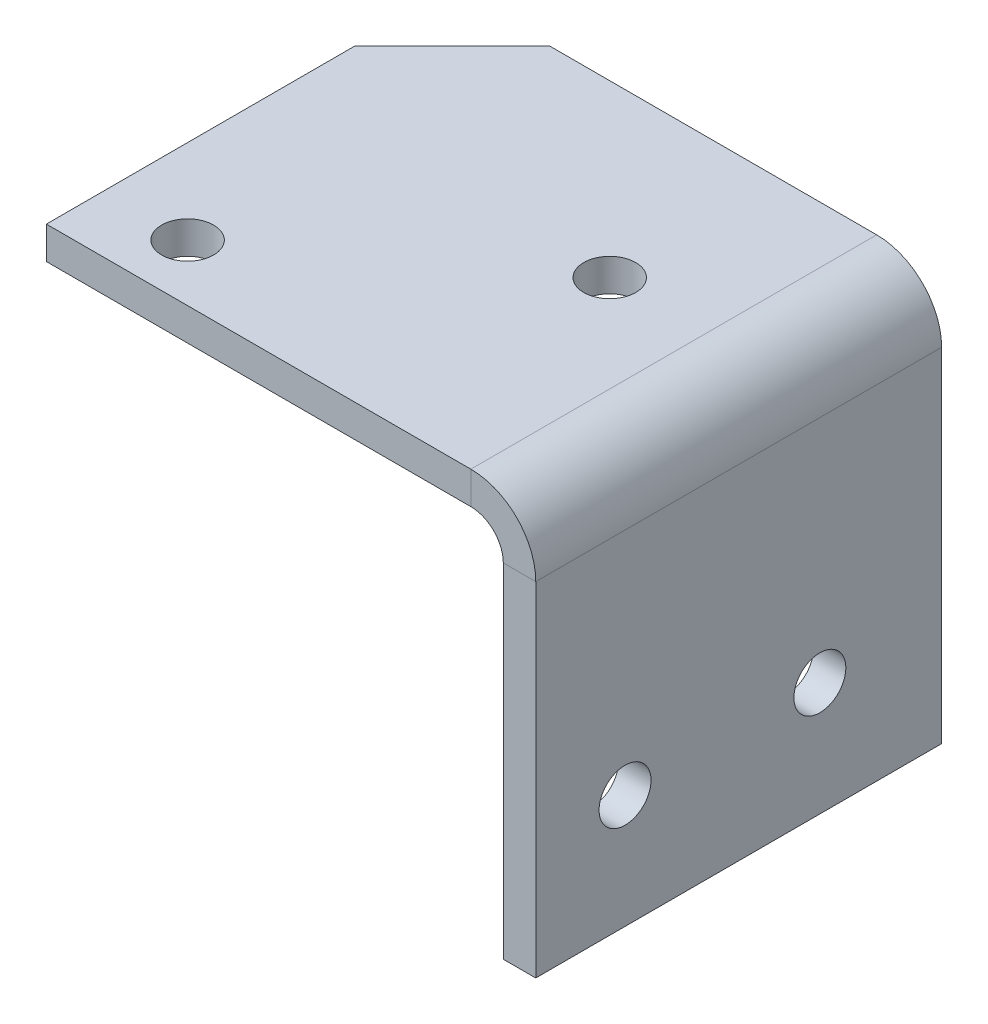
ISO-10303-21;
HEADER;
FILE_DESCRIPTION(('STEP AP214'),'2;1');
FILE_NAME('part.step','',(''),(''),'','','');
FILE_SCHEMA(('AUTOMOTIVE_DESIGN { 1 0 10303 214 1 1 1 1 }'));
ENDSEC;
DATA;
#1=APPLICATION_CONTEXT('core data for automotive mechanical design processes');
#2=APPLICATION_PROTOCOL_DEFINITION('international standard','automotive_design',2000,#1);
#3=PRODUCT_CONTEXT('',#1,'mechanical');
#4=PRODUCT('Part','Part','',(#3));
#5=PRODUCT_RELATED_PRODUCT_CATEGORY('part','',(#4));
#6=PRODUCT_DEFINITION_FORMATION('','',#4);
#7=PRODUCT_DEFINITION_CONTEXT('part definition',#1,'design');
#8=PRODUCT_DEFINITION('design','',#6,#7);
#9=PRODUCT_DEFINITION_SHAPE('','',#8);
#10=(LENGTH_UNIT() NAMED_UNIT(*) SI_UNIT(.MILLI.,.METRE.));
#11=(NAMED_UNIT(*) PLANE_ANGLE_UNIT() SI_UNIT($,.RADIAN.));
#12=(NAMED_UNIT(*) SI_UNIT($,.STERADIAN.) SOLID_ANGLE_UNIT());
#13=UNCERTAINTY_MEASURE_WITH_UNIT(LENGTH_MEASURE(1.E-05),#10,'distance_accuracy_value','');
#14=(GEOMETRIC_REPRESENTATION_CONTEXT(3) GLOBAL_UNCERTAINTY_ASSIGNED_CONTEXT((#13)) GLOBAL_UNIT_ASSIGNED_CONTEXT((#10,
#11,#12)) REPRESENTATION_CONTEXT('',''));
#15=CARTESIAN_POINT('',(0.,0.,0.));
#16=DIRECTION('',(0.,0.,1.));
#17=DIRECTION('',(1.,0.,0.));
#18=AXIS2_PLACEMENT_3D('',#15,#16,#17);
#19=CARTESIAN_POINT('',(23.8561944901924,23.1438055098077,0.));
#20=DIRECTION('',(0.,1.,0.));
#21=DIRECTION('',(0.,0.,-1.));
#22=AXIS2_PLACEMENT_3D('',#19,#20,#21);
#23=PLANE('',#22);
#24=CARTESIAN_POINT('',(-7.94380550980765,23.1438055098076,-14.5));
#25=DIRECTION('',(0.,1.,0.));
#26=DIRECTION('',(0.,0.,-1.));
#27=AXIS2_PLACEMENT_3D('',#24,#25,#26);
#28=CIRCLE('',#27,1.6);
#29=CARTESIAN_POINT('',(-7.94380550980765,23.1438055098076,-16.1));
#30=VERTEX_POINT('',#29);
#31=EDGE_CURVE('E196',#30,#30,#28,.T.);
#32=ORIENTED_EDGE('',*,*,#31,.T.);
#33=EDGE_LOOP('',(#32));
#34=FACE_BOUND('',#33,.T.);
#35=CARTESIAN_POINT('',(-22.9438055098076,23.1438055098076,-3.49999999999999));
#36=DIRECTION('',(0.,1.,0.));
#37=DIRECTION('',(0.,0.,-1.));
#38=AXIS2_PLACEMENT_3D('',#35,#36,#37);
#39=CIRCLE('',#38,1.6);
#40=CARTESIAN_POINT('',(-22.9438055098076,23.1438055098076,-5.09999999999999));
#41=VERTEX_POINT('',#40);
#42=EDGE_CURVE('E190',#41,#41,#39,.T.);
#43=ORIENTED_EDGE('',*,*,#42,.T.);
#44=EDGE_LOOP('',(#43));
#45=FACE_BOUND('',#44,.T.);
#46=DIRECTION('',(0.,0.,1.));
#47=VECTOR('',#46,1.);
#48=CARTESIAN_POINT('',(-28.1438055098076,23.1438055098076,0.));
#49=LINE('',#48,#47);
#50=CARTESIAN_POINT('',(-28.1438055098076,23.1438055098076,-18.9999999999999));
#51=VERTEX_POINT('',#50);
#52=CARTESIAN_POINT('',(-28.1438055098076,23.1438055098076,0.));
#53=VERTEX_POINT('',#52);
#54=EDGE_CURVE('E204',#51,#53,#49,.T.);
#55=ORIENTED_EDGE('',*,*,#54,.F.);
#56=DIRECTION('',(-0.707106781186548,0.,0.707106781186548));
#57=VECTOR('',#56,1.);
#58=CARTESIAN_POINT('',(-28.1438055098076,23.1438055098076,-18.9999999999999));
#59=LINE('',#58,#57);
#60=CARTESIAN_POINT('',(-22.1438055098076,23.1438055098076,-25.));
#61=VERTEX_POINT('',#60);
#62=EDGE_CURVE('E67',#51,#61,#59,.F.);
#63=ORIENTED_EDGE('',*,*,#62,.T.);
#64=DIRECTION('',(-1.,0.,0.));
#65=VECTOR('',#64,1.);
#66=CARTESIAN_POINT('',(-28.1438055098076,23.1438055098076,-25.));
#67=LINE('',#66,#65);
#68=CARTESIAN_POINT('',(-2.00000000000001,23.1438055098077,-25.));
#69=VERTEX_POINT('',#68);
#70=EDGE_CURVE('E207',#69,#61,#67,.T.);
#71=ORIENTED_EDGE('',*,*,#70,.F.);
#72=DIRECTION('',(0.,0.,1.));
#73=VECTOR('',#72,1.);
#74=CARTESIAN_POINT('',(-2.,23.1438055098077,0.));
#75=LINE('',#74,#73);
#76=CARTESIAN_POINT('',(-2.00000000000001,23.1438055098077,0.));
#77=VERTEX_POINT('',#76);
#78=EDGE_CURVE('E213',#69,#77,#75,.T.);
#79=ORIENTED_EDGE('',*,*,#78,.T.);
#80=DIRECTION('',(1.,0.,0.));
#81=VECTOR('',#80,1.);
#82=CARTESIAN_POINT('',(-28.1438055098076,23.1438055098076,0.));
#83=LINE('',#82,#81);
#84=EDGE_CURVE('E199',#53,#77,#83,.T.);
#85=ORIENTED_EDGE('',*,*,#84,.F.);
#86=EDGE_LOOP('',(#55,#63,#71,#79,#85));
#87=FACE_BOUND('',#86,.T.);
#88=ADVANCED_FACE('F44',(#34,#45,#87),#23,.F.);
#89=CARTESIAN_POINT('',(-28.1438055098077,25.1438055098076,-25.));
#90=DIRECTION('',(0.,0.,1.));
#91=DIRECTION('',(1.,0.,0.));
#92=AXIS2_PLACEMENT_3D('',#89,#90,#91);
#93=PLANE('',#92);
#94=ORIENTED_EDGE('',*,*,#70,.T.);
#95=DIRECTION('',(0.,1.,0.));
#96=VECTOR('',#95,1.);
#97=CARTESIAN_POINT('',(-22.1438055098076,25.1438055098076,-25.));
#98=LINE('',#97,#96);
#99=CARTESIAN_POINT('',(-22.1438055098076,25.1438055098076,-25.));
#100=VERTEX_POINT('',#99);
#101=EDGE_CURVE('E53',#61,#100,#98,.T.);
#102=ORIENTED_EDGE('',*,*,#101,.T.);
#103=DIRECTION('',(-1.,0.,0.));
#104=VECTOR('',#103,1.);
#105=CARTESIAN_POINT('',(-28.1438055098077,25.1438055098076,-25.));
#106=LINE('',#105,#104);
#107=CARTESIAN_POINT('',(-2.00000000000001,25.1438055098077,-25.));
#108=VERTEX_POINT('',#107);
#109=EDGE_CURVE('E203',#108,#100,#106,.T.);
#110=ORIENTED_EDGE('',*,*,#109,.F.);
#111=DIRECTION('',(0.,-1.,0.));
#112=VECTOR('',#111,1.);
#113=CARTESIAN_POINT('',(-2.00000000000001,25.1438055098077,-25.));
#114=LINE('',#113,#112);
#115=EDGE_CURVE('E216',#108,#69,#114,.T.);
#116=ORIENTED_EDGE('',*,*,#115,.T.);
#117=EDGE_LOOP('',(#94,#102,#110,#116));
#118=FACE_BOUND('',#117,.T.);
#119=ADVANCED_FACE('F250',(#118),#93,.F.);
#120=CARTESIAN_POINT('',(-28.1438055098077,25.1438055098076,0.));
#121=DIRECTION('',(0.,0.,-1.));
#122=DIRECTION('',(-1.,0.,0.));
#123=AXIS2_PLACEMENT_3D('',#120,#121,#122);
#124=PLANE('',#123);
#125=ORIENTED_EDGE('',*,*,#84,.T.);
#126=DIRECTION('',(0.,1.,0.));
#127=VECTOR('',#126,1.);
#128=CARTESIAN_POINT('',(-2.00000000000001,25.1438055098077,0.));
#129=LINE('',#128,#127);
#130=CARTESIAN_POINT('',(-2.00000000000002,25.1438055098076,0.));
#131=VERTEX_POINT('',#130);
#132=EDGE_CURVE('E211',#77,#131,#129,.T.);
#133=ORIENTED_EDGE('',*,*,#132,.T.);
#134=DIRECTION('',(1.,0.,0.));
#135=VECTOR('',#134,1.);
#136=CARTESIAN_POINT('',(-28.1438055098077,25.1438055098076,0.));
#137=LINE('',#136,#135);
#138=CARTESIAN_POINT('',(-28.1438055098077,25.1438055098076,0.));
#139=VERTEX_POINT('',#138);
#140=EDGE_CURVE('E206',#139,#131,#137,.T.);
#141=ORIENTED_EDGE('',*,*,#140,.F.);
#142=DIRECTION('',(0.,-1.,0.));
#143=VECTOR('',#142,1.);
#144=CARTESIAN_POINT('',(-28.1438055098077,25.1438055098076,0.));
#145=LINE('',#144,#143);
#146=EDGE_CURVE('E202',#139,#53,#145,.T.);
#147=ORIENTED_EDGE('',*,*,#146,.T.);
#148=EDGE_LOOP('',(#125,#133,#141,#147));
#149=FACE_BOUND('',#148,.T.);
#150=ADVANCED_FACE('F237',(#149),#124,.F.);
#151=CARTESIAN_POINT('',(-28.1438055098077,25.1438055098076,0.));
#152=DIRECTION('',(1.,0.,0.));
#153=DIRECTION('',(0.,0.,-1.));
#154=AXIS2_PLACEMENT_3D('',#151,#152,#153);
#155=PLANE('',#154);
#156=DIRECTION('',(0.,0.,1.));
#157=VECTOR('',#156,1.);
#158=CARTESIAN_POINT('',(-28.1438055098077,25.1438055098076,0.));
#159=LINE('',#158,#157);
#160=CARTESIAN_POINT('',(-28.1438055098077,25.1438055098076,-18.9999999999999));
#161=VERTEX_POINT('',#160);
#162=EDGE_CURVE('E200',#161,#139,#159,.T.);
#163=ORIENTED_EDGE('',*,*,#162,.F.);
#164=DIRECTION('',(0.,-1.,0.));
#165=VECTOR('',#164,1.);
#166=CARTESIAN_POINT('',(-28.1438055098077,25.1438055098076,-18.9999999999999));
#167=LINE('',#166,#165);
#168=EDGE_CURVE('E219',#161,#51,#167,.T.);
#169=ORIENTED_EDGE('',*,*,#168,.T.);
#170=ORIENTED_EDGE('',*,*,#54,.T.);
#171=ORIENTED_EDGE('',*,*,#146,.F.);
#172=EDGE_LOOP('',(#163,#169,#170,#171));
#173=FACE_BOUND('',#172,.T.);
#174=ADVANCED_FACE('F230',(#173),#155,.F.);
#175=CARTESIAN_POINT('',(23.8561944901923,25.1438055098077,0.));
#176=DIRECTION('',(0.,1.,0.));
#177=DIRECTION('',(0.,0.,-1.));
#178=AXIS2_PLACEMENT_3D('',#175,#176,#177);
#179=PLANE('',#178);
#180=ORIENTED_EDGE('',*,*,#109,.T.);
#181=DIRECTION('',(0.707106781186548,0.,-0.707106781186548));
#182=VECTOR('',#181,1.);
#183=CARTESIAN_POINT('',(-11.6438055098076,25.1438055098076,-35.5));
#184=LINE('',#183,#182);
#185=EDGE_CURVE('E12',#100,#161,#184,.F.);
#186=ORIENTED_EDGE('',*,*,#185,.T.);
#187=ORIENTED_EDGE('',*,*,#162,.T.);
#188=ORIENTED_EDGE('',*,*,#140,.T.);
#189=DIRECTION('',(0.,0.,1.));
#190=VECTOR('',#189,1.);
#191=CARTESIAN_POINT('',(-2.00000000000001,25.1438055098077,0.));
#192=LINE('',#191,#190);
#193=EDGE_CURVE('E151',#108,#131,#192,.T.);
#194=ORIENTED_EDGE('',*,*,#193,.F.);
#195=EDGE_LOOP('',(#180,#186,#187,#188,#194));
#196=FACE_BOUND('',#195,.T.);
#197=CARTESIAN_POINT('',(-22.9438055098077,25.1438055098076,-3.49999999999999));
#198=DIRECTION('',(0.,1.,0.));
#199=DIRECTION('',(0.,0.,-1.));
#200=AXIS2_PLACEMENT_3D('',#197,#198,#199);
#201=CIRCLE('',#200,1.6);
#202=CARTESIAN_POINT('',(-22.9438055098077,25.1438055098076,-5.09999999999999));
#203=VERTEX_POINT('',#202);
#204=EDGE_CURVE('E165',#203,#203,#201,.T.);
#205=ORIENTED_EDGE('',*,*,#204,.F.);
#206=EDGE_LOOP('',(#205));
#207=FACE_BOUND('',#206,.T.);
#208=CARTESIAN_POINT('',(-7.94380550980766,25.1438055098076,-14.5));
#209=DIRECTION('',(0.,1.,0.));
#210=DIRECTION('',(0.,0.,-1.));
#211=AXIS2_PLACEMENT_3D('',#208,#209,#210);
#212=CIRCLE('',#211,1.6);
#213=CARTESIAN_POINT('',(-7.94380550980766,25.1438055098076,-16.1));
#214=VERTEX_POINT('',#213);
#215=EDGE_CURVE('E193',#214,#214,#212,.T.);
#216=ORIENTED_EDGE('',*,*,#215,.F.);
#217=EDGE_LOOP('',(#216));
#218=FACE_BOUND('',#217,.T.);
#219=ADVANCED_FACE('F240',(#196,#207,#218),#179,.T.);
#220=CARTESIAN_POINT('',(-7.94380550980766,25.1438055098076,-14.5));
#221=DIRECTION('',(0.,1.,0.));
#222=DIRECTION('',(0.,0.,-1.));
#223=AXIS2_PLACEMENT_3D('',#220,#221,#222);
#224=CYLINDRICAL_SURFACE('',#223,1.6);
#225=ORIENTED_EDGE('',*,*,#31,.F.);
#226=EDGE_LOOP('',(#225));
#227=FACE_BOUND('',#226,.T.);
#228=ORIENTED_EDGE('',*,*,#215,.T.);
#229=EDGE_LOOP('',(#228));
#230=FACE_BOUND('',#229,.T.);
#231=ADVANCED_FACE('F262',(#227,#230),#224,.F.);
#232=CARTESIAN_POINT('',(-22.9438055098077,25.1438055098076,-3.49999999999999));
#233=DIRECTION('',(0.,1.,0.));
#234=DIRECTION('',(0.,0.,-1.));
#235=AXIS2_PLACEMENT_3D('',#232,#233,#234);
#236=CYLINDRICAL_SURFACE('',#235,1.6);
#237=ORIENTED_EDGE('',*,*,#42,.F.);
#238=EDGE_LOOP('',(#237));
#239=FACE_BOUND('',#238,.T.);
#240=ORIENTED_EDGE('',*,*,#204,.T.);
#241=EDGE_LOOP('',(#240));
#242=FACE_BOUND('',#241,.T.);
#243=ADVANCED_FACE('F267',(#239,#242),#236,.F.);
#244=CARTESIAN_POINT('',(2.,0.,0.));
#245=DIRECTION('',(0.,1.,0.));
#246=DIRECTION('',(0.,0.,1.));
#247=AXIS2_PLACEMENT_3D('',#244,#245,#246);
#248=PLANE('',#247);
#249=DIRECTION('',(0.,0.,-1.));
#250=VECTOR('',#249,1.);
#251=CARTESIAN_POINT('',(0.,0.,0.));
#252=LINE('',#251,#250);
#253=CARTESIAN_POINT('',(0.,0.,0.));
#254=VERTEX_POINT('',#253);
#255=CARTESIAN_POINT('',(0.,0.,-25.));
#256=VERTEX_POINT('',#255);
#257=EDGE_CURVE('E146',#254,#256,#252,.T.);
#258=ORIENTED_EDGE('',*,*,#257,.T.);
#259=DIRECTION('',(-1.,0.,0.));
#260=VECTOR('',#259,1.);
#261=CARTESIAN_POINT('',(2.,0.,-25.));
#262=LINE('',#261,#260);
#263=CARTESIAN_POINT('',(2.,0.,-25.));
#264=VERTEX_POINT('',#263);
#265=EDGE_CURVE('E166',#264,#256,#262,.T.);
#266=ORIENTED_EDGE('',*,*,#265,.F.);
#267=DIRECTION('',(0.,0.,-1.));
#268=VECTOR('',#267,1.);
#269=CARTESIAN_POINT('',(2.,0.,0.));
#270=LINE('',#269,#268);
#271=CARTESIAN_POINT('',(2.,0.,0.));
#272=VERTEX_POINT('',#271);
#273=EDGE_CURVE('E125',#272,#264,#270,.T.);
#274=ORIENTED_EDGE('',*,*,#273,.F.);
#275=DIRECTION('',(-1.,0.,0.));
#276=VECTOR('',#275,1.);
#277=CARTESIAN_POINT('',(2.,0.,0.));
#278=LINE('',#277,#276);
#279=EDGE_CURVE('E122',#272,#254,#278,.T.);
#280=ORIENTED_EDGE('',*,*,#279,.T.);
#281=EDGE_LOOP('',(#258,#266,#274,#280));
#282=FACE_BOUND('',#281,.T.);
#283=ADVANCED_FACE('F271',(#282),#248,.F.);
#284=CARTESIAN_POINT('',(2.,7.,-5.49999999999999));
#285=DIRECTION('',(1.,0.,0.));
#286=DIRECTION('',(0.,0.,-1.));
#287=AXIS2_PLACEMENT_3D('',#284,#285,#286);
#288=CYLINDRICAL_SURFACE('',#287,1.6);
#289=CARTESIAN_POINT('',(0.,7.,-5.49999999999999));
#290=DIRECTION('',(1.,0.,0.));
#291=DIRECTION('',(0.,0.,-1.));
#292=AXIS2_PLACEMENT_3D('',#289,#290,#291);
#293=CIRCLE('',#292,1.6);
#294=CARTESIAN_POINT('',(0.,7.,-7.09999999999999));
#295=VERTEX_POINT('',#294);
#296=EDGE_CURVE('E172',#295,#295,#293,.T.);
#297=ORIENTED_EDGE('',*,*,#296,.F.);
#298=EDGE_LOOP('',(#297));
#299=FACE_BOUND('',#298,.T.);
#300=CARTESIAN_POINT('',(2.,7.,-5.49999999999999));
#301=DIRECTION('',(1.,0.,0.));
#302=DIRECTION('',(0.,0.,-1.));
#303=AXIS2_PLACEMENT_3D('',#300,#301,#302);
#304=CIRCLE('',#303,1.6);
#305=CARTESIAN_POINT('',(2.,7.,-7.09999999999999));
#306=VERTEX_POINT('',#305);
#307=EDGE_CURVE('E182',#306,#306,#304,.T.);
#308=ORIENTED_EDGE('',*,*,#307,.T.);
#309=EDGE_LOOP('',(#308));
#310=FACE_BOUND('',#309,.T.);
#311=ADVANCED_FACE('F290',(#299,#310),#288,.F.);
#312=CARTESIAN_POINT('',(2.,7.,-17.5));
#313=DIRECTION('',(1.,0.,0.));
#314=DIRECTION('',(0.,0.,-1.));
#315=AXIS2_PLACEMENT_3D('',#312,#313,#314);
#316=CYLINDRICAL_SURFACE('',#315,1.6);
#317=CARTESIAN_POINT('',(0.,7.,-17.5));
#318=DIRECTION('',(1.,0.,0.));
#319=DIRECTION('',(0.,0.,-1.));
#320=AXIS2_PLACEMENT_3D('',#317,#318,#319);
#321=CIRCLE('',#320,1.6);
#322=CARTESIAN_POINT('',(0.,7.,-19.1));
#323=VERTEX_POINT('',#322);
#324=EDGE_CURVE('E169',#323,#323,#321,.T.);
#325=ORIENTED_EDGE('',*,*,#324,.F.);
#326=EDGE_LOOP('',(#325));
#327=FACE_BOUND('',#326,.T.);
#328=CARTESIAN_POINT('',(2.,7.,-17.5));
#329=DIRECTION('',(1.,0.,0.));
#330=DIRECTION('',(0.,0.,-1.));
#331=AXIS2_PLACEMENT_3D('',#328,#329,#330);
#332=CIRCLE('',#331,1.6);
#333=CARTESIAN_POINT('',(2.,7.,-19.1));
#334=VERTEX_POINT('',#333);
#335=EDGE_CURVE('E179',#334,#334,#332,.T.);
#336=ORIENTED_EDGE('',*,*,#335,.T.);
#337=EDGE_LOOP('',(#336));
#338=FACE_BOUND('',#337,.T.);
#339=ADVANCED_FACE('F286',(#327,#338),#316,.F.);
#340=CARTESIAN_POINT('',(2.,0.,0.));
#341=DIRECTION('',(1.,0.,0.));
#342=DIRECTION('',(0.,0.,-1.));
#343=AXIS2_PLACEMENT_3D('',#340,#341,#342);
#344=PLANE('',#343);
#345=ORIENTED_EDGE('',*,*,#335,.F.);
#346=EDGE_LOOP('',(#345));
#347=FACE_BOUND('',#346,.T.);
#348=ORIENTED_EDGE('',*,*,#307,.F.);
#349=EDGE_LOOP('',(#348));
#350=FACE_BOUND('',#349,.T.);
#351=DIRECTION('',(0.,1.,0.));
#352=VECTOR('',#351,1.);
#353=CARTESIAN_POINT('',(2.,52.,-25.));
#354=LINE('',#353,#352);
#355=CARTESIAN_POINT('',(2.,21.1438055098077,-25.));
#356=VERTEX_POINT('',#355);
#357=EDGE_CURVE('E131',#264,#356,#354,.T.);
#358=ORIENTED_EDGE('',*,*,#357,.T.);
#359=DIRECTION('',(0.,0.,1.));
#360=VECTOR('',#359,1.);
#361=CARTESIAN_POINT('',(2.,21.1438055098076,0.));
#362=LINE('',#361,#360);
#363=CARTESIAN_POINT('',(2.,21.1438055098077,0.));
#364=VERTEX_POINT('',#363);
#365=EDGE_CURVE('E126',#356,#364,#362,.T.);
#366=ORIENTED_EDGE('',*,*,#365,.T.);
#367=DIRECTION('',(0.,-1.,0.));
#368=VECTOR('',#367,1.);
#369=CARTESIAN_POINT('',(2.,52.,0.));
#370=LINE('',#369,#368);
#371=EDGE_CURVE('E115',#364,#272,#370,.T.);
#372=ORIENTED_EDGE('',*,*,#371,.T.);
#373=ORIENTED_EDGE('',*,*,#273,.T.);
#374=EDGE_LOOP('',(#358,#366,#372,#373));
#375=FACE_BOUND('',#374,.T.);
#376=ADVANCED_FACE('F129',(#347,#350,#375),#344,.T.);
#377=CARTESIAN_POINT('',(2.,52.,0.));
#378=DIRECTION('',(0.,0.,-1.));
#379=DIRECTION('',(0.,1.,0.));
#380=AXIS2_PLACEMENT_3D('',#377,#378,#379);
#381=PLANE('',#380);
#382=DIRECTION('',(1.,0.,0.));
#383=VECTOR('',#382,1.);
#384=CARTESIAN_POINT('',(2.,21.1438055098076,0.));
#385=LINE('',#384,#383);
#386=CARTESIAN_POINT('',(0.,21.1438055098077,0.));
#387=VERTEX_POINT('',#386);
#388=EDGE_CURVE('E119',#387,#364,#385,.T.);
#389=ORIENTED_EDGE('',*,*,#388,.F.);
#390=DIRECTION('',(0.,-1.,0.));
#391=VECTOR('',#390,1.);
#392=CARTESIAN_POINT('',(0.,52.,0.));
#393=LINE('',#392,#391);
#394=EDGE_CURVE('E175',#387,#254,#393,.T.);
#395=ORIENTED_EDGE('',*,*,#394,.T.);
#396=ORIENTED_EDGE('',*,*,#279,.F.);
#397=ORIENTED_EDGE('',*,*,#371,.F.);
#398=EDGE_LOOP('',(#389,#395,#396,#397));
#399=FACE_BOUND('',#398,.T.);
#400=ADVANCED_FACE('F117',(#399),#381,.F.);
#401=CARTESIAN_POINT('',(0.,0.,0.));
#402=DIRECTION('',(1.,0.,0.));
#403=DIRECTION('',(0.,0.,-1.));
#404=AXIS2_PLACEMENT_3D('',#401,#402,#403);
#405=PLANE('',#404);
#406=DIRECTION('',(0.,0.,1.));
#407=VECTOR('',#406,1.);
#408=CARTESIAN_POINT('',(0.,21.1438055098076,0.));
#409=LINE('',#408,#407);
#410=CARTESIAN_POINT('',(0.,21.1438055098077,-25.));
#411=VERTEX_POINT('',#410);
#412=EDGE_CURVE('E147',#411,#387,#409,.T.);
#413=ORIENTED_EDGE('',*,*,#412,.F.);
#414=DIRECTION('',(0.,1.,0.));
#415=VECTOR('',#414,1.);
#416=CARTESIAN_POINT('',(0.,52.,-25.));
#417=LINE('',#416,#415);
#418=EDGE_CURVE('E163',#256,#411,#417,.T.);
#419=ORIENTED_EDGE('',*,*,#418,.F.);
#420=ORIENTED_EDGE('',*,*,#257,.F.);
#421=ORIENTED_EDGE('',*,*,#394,.F.);
#422=EDGE_LOOP('',(#413,#419,#420,#421));
#423=FACE_BOUND('',#422,.T.);
#424=ORIENTED_EDGE('',*,*,#296,.T.);
#425=EDGE_LOOP('',(#424));
#426=FACE_BOUND('',#425,.T.);
#427=ORIENTED_EDGE('',*,*,#324,.T.);
#428=EDGE_LOOP('',(#427));
#429=FACE_BOUND('',#428,.T.);
#430=ADVANCED_FACE('F277',(#423,#426,#429),#405,.F.);
#431=CARTESIAN_POINT('',(2.,52.,-25.));
#432=DIRECTION('',(0.,0.,1.));
#433=DIRECTION('',(0.,-1.,0.));
#434=AXIS2_PLACEMENT_3D('',#431,#432,#433);
#435=PLANE('',#434);
#436=DIRECTION('',(-1.,0.,0.));
#437=VECTOR('',#436,1.);
#438=CARTESIAN_POINT('',(2.,21.1438055098076,-25.));
#439=LINE('',#438,#437);
#440=EDGE_CURVE('E152',#356,#411,#439,.T.);
#441=ORIENTED_EDGE('',*,*,#440,.F.);
#442=ORIENTED_EDGE('',*,*,#357,.F.);
#443=ORIENTED_EDGE('',*,*,#265,.T.);
#444=ORIENTED_EDGE('',*,*,#418,.T.);
#445=EDGE_LOOP('',(#441,#442,#443,#444));
#446=FACE_BOUND('',#445,.T.);
#447=ADVANCED_FACE('F273',(#446),#435,.F.);
#448=CARTESIAN_POINT('',(-2.,21.1438055098076,-25.));
#449=DIRECTION('',(0.,0.,-1.));
#450=DIRECTION('',(-1.,0.,0.));
#451=AXIS2_PLACEMENT_3D('',#448,#449,#450);
#452=PLANE('',#451);
#453=ORIENTED_EDGE('',*,*,#440,.T.);
#454=CARTESIAN_POINT('',(-2.,21.1438055098076,-25.));
#455=DIRECTION('',(0.,0.,1.));
#456=DIRECTION('',(1.,0.,0.));
#457=AXIS2_PLACEMENT_3D('',#454,#455,#456);
#458=CIRCLE('',#457,2.);
#459=EDGE_CURVE('E159',#411,#69,#458,.T.);
#460=ORIENTED_EDGE('',*,*,#459,.T.);
#461=ORIENTED_EDGE('',*,*,#115,.F.);
#462=CARTESIAN_POINT('',(-2.,21.1438055098076,-25.));
#463=DIRECTION('',(0.,0.,1.));
#464=DIRECTION('',(1.,0.,0.));
#465=AXIS2_PLACEMENT_3D('',#462,#463,#464);
#466=CIRCLE('',#465,4.);
#467=EDGE_CURVE('E153',#356,#108,#466,.T.);
#468=ORIENTED_EDGE('',*,*,#467,.F.);
#469=EDGE_LOOP('',(#453,#460,#461,#468));
#470=FACE_BOUND('',#469,.T.);
#471=ADVANCED_FACE('F276',(#470),#452,.T.);
#472=CARTESIAN_POINT('',(-2.,21.1438055098076,0.));
#473=DIRECTION('',(0.,0.,1.));
#474=DIRECTION('',(0.,-1.,0.));
#475=AXIS2_PLACEMENT_3D('',#472,#473,#474);
#476=PLANE('',#475);
#477=CARTESIAN_POINT('',(-2.,21.1438055098076,0.));
#478=DIRECTION('',(0.,0.,1.));
#479=DIRECTION('',(1.,0.,0.));
#480=AXIS2_PLACEMENT_3D('',#477,#478,#479);
#481=CIRCLE('',#480,2.);
#482=EDGE_CURVE('E145',#77,#387,#481,.F.);
#483=ORIENTED_EDGE('',*,*,#482,.T.);
#484=ORIENTED_EDGE('',*,*,#388,.T.);
#485=CARTESIAN_POINT('',(-2.,21.1438055098076,0.));
#486=DIRECTION('',(0.,0.,-1.));
#487=DIRECTION('',(0.,1.,0.));
#488=AXIS2_PLACEMENT_3D('',#485,#486,#487);
#489=CIRCLE('',#488,4.);
#490=EDGE_CURVE('E143',#131,#364,#489,.T.);
#491=ORIENTED_EDGE('',*,*,#490,.F.);
#492=ORIENTED_EDGE('',*,*,#132,.F.);
#493=EDGE_LOOP('',(#483,#484,#491,#492));
#494=FACE_BOUND('',#493,.T.);
#495=ADVANCED_FACE('F141',(#494),#476,.T.);
#496=CARTESIAN_POINT('',(-2.,21.1438055098076,-38.0187501634083));
#497=DIRECTION('',(0.,0.,1.));
#498=DIRECTION('',(1.,0.,0.));
#499=AXIS2_PLACEMENT_3D('',#496,#497,#498);
#500=CYLINDRICAL_SURFACE('',#499,4.);
#501=ORIENTED_EDGE('',*,*,#193,.T.);
#502=ORIENTED_EDGE('',*,*,#490,.T.);
#503=ORIENTED_EDGE('',*,*,#365,.F.);
#504=ORIENTED_EDGE('',*,*,#467,.T.);
#505=EDGE_LOOP('',(#501,#502,#503,#504));
#506=FACE_BOUND('',#505,.T.);
#507=ADVANCED_FACE('F150',(#506),#500,.T.);
#508=CARTESIAN_POINT('',(-2.,21.1438055098076,-38.0187501634083));
#509=DIRECTION('',(0.,0.,1.));
#510=DIRECTION('',(1.,0.,0.));
#511=AXIS2_PLACEMENT_3D('',#508,#509,#510);
#512=CYLINDRICAL_SURFACE('',#511,2.);
#513=ORIENTED_EDGE('',*,*,#78,.F.);
#514=ORIENTED_EDGE('',*,*,#459,.F.);
#515=ORIENTED_EDGE('',*,*,#412,.T.);
#516=ORIENTED_EDGE('',*,*,#482,.F.);
#517=EDGE_LOOP('',(#513,#514,#515,#516));
#518=FACE_BOUND('',#517,.T.);
#519=ADVANCED_FACE('F243',(#518),#512,.F.);
#520=CARTESIAN_POINT('',(-28.1438055098077,25.1438055098076,-18.9999999999999));
#521=DIRECTION('',(0.707106781186547,0.,0.707106781186547));
#522=DIRECTION('',(0.,-1.,0.));
#523=AXIS2_PLACEMENT_3D('',#520,#521,#522);
#524=PLANE('',#523);
#525=ORIENTED_EDGE('',*,*,#185,.F.);
#526=ORIENTED_EDGE('',*,*,#101,.F.);
#527=ORIENTED_EDGE('',*,*,#62,.F.);
#528=ORIENTED_EDGE('',*,*,#168,.F.);
#529=EDGE_LOOP('',(#525,#526,#527,#528));
#530=FACE_BOUND('',#529,.T.);
#531=ADVANCED_FACE('F47',(#530),#524,.F.);
#532=CLOSED_SHELL('',(#88,#119,#150,#174,#219,#231,#243,#283,#311,#339,#376,#400,#430,#447,#471,
#495,#507,#519,#531));
#533=MANIFOLD_SOLID_BREP('B2',#532);
#534=ADVANCED_BREP_SHAPE_REPRESENTATION('',(#18,#533),#14);
#535=SHAPE_DEFINITION_REPRESENTATION(#9,#534);
ENDSEC;
END-ISO-10303-21;
